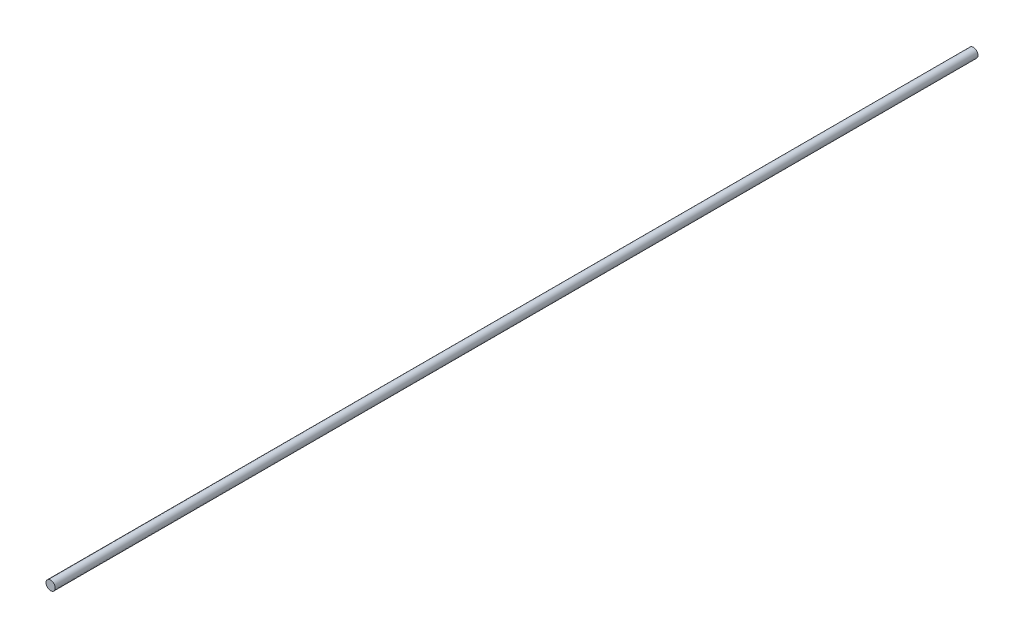
ISO-10303-21;
HEADER;
FILE_DESCRIPTION(('STEP AP214'),'2;1');
FILE_NAME('part.step','',(''),(''),'','','');
FILE_SCHEMA(('AUTOMOTIVE_DESIGN { 1 0 10303 214 1 1 1 1 }'));
ENDSEC;
DATA;
#1=APPLICATION_CONTEXT('core data for automotive mechanical design processes');
#2=APPLICATION_PROTOCOL_DEFINITION('international standard','automotive_design',2000,#1);
#3=PRODUCT_CONTEXT('',#1,'mechanical');
#4=PRODUCT('Part','Part','',(#3));
#5=PRODUCT_RELATED_PRODUCT_CATEGORY('part','',(#4));
#6=PRODUCT_DEFINITION_FORMATION('','',#4);
#7=PRODUCT_DEFINITION_CONTEXT('part definition',#1,'design');
#8=PRODUCT_DEFINITION('design','',#6,#7);
#9=PRODUCT_DEFINITION_SHAPE('','',#8);
#10=(LENGTH_UNIT() NAMED_UNIT(*) SI_UNIT(.MILLI.,.METRE.));
#11=(NAMED_UNIT(*) PLANE_ANGLE_UNIT() SI_UNIT($,.RADIAN.));
#12=(NAMED_UNIT(*) SI_UNIT($,.STERADIAN.) SOLID_ANGLE_UNIT());
#13=UNCERTAINTY_MEASURE_WITH_UNIT(LENGTH_MEASURE(1.E-05),#10,'distance_accuracy_value','');
#14=(GEOMETRIC_REPRESENTATION_CONTEXT(3) GLOBAL_UNCERTAINTY_ASSIGNED_CONTEXT((#13)) GLOBAL_UNIT_ASSIGNED_CONTEXT((#10,
#11,#12)) REPRESENTATION_CONTEXT('',''));
#15=CARTESIAN_POINT('',(0.,0.,0.));
#16=DIRECTION('',(0.,0.,1.));
#17=DIRECTION('',(1.,0.,0.));
#18=AXIS2_PLACEMENT_3D('',#15,#16,#17);
#19=CARTESIAN_POINT('',(0.,0.,150.));
#20=DIRECTION('',(0.,0.,-1.));
#21=DIRECTION('',(-1.,0.,0.));
#22=AXIS2_PLACEMENT_3D('',#19,#20,#21);
#23=CYLINDRICAL_SURFACE('',#22,0.75);
#24=CARTESIAN_POINT('',(0.,0.,150.));
#25=DIRECTION('',(0.,0.,1.));
#26=DIRECTION('',(1.,0.,0.));
#27=AXIS2_PLACEMENT_3D('',#24,#25,#26);
#28=CIRCLE('',#27,0.75);
#29=CARTESIAN_POINT('',(0.75,0.,150.));
#30=VERTEX_POINT('',#29);
#31=EDGE_CURVE('E10',#30,#30,#28,.T.);
#32=ORIENTED_EDGE('',*,*,#31,.F.);
#33=EDGE_LOOP('',(#32));
#34=FACE_BOUND('',#33,.T.);
#35=CARTESIAN_POINT('',(0.,0.,0.));
#36=DIRECTION('',(0.,0.,1.));
#37=DIRECTION('',(1.,0.,0.));
#38=AXIS2_PLACEMENT_3D('',#35,#36,#37);
#39=CIRCLE('',#38,0.75);
#40=CARTESIAN_POINT('',(0.75,0.,0.));
#41=VERTEX_POINT('',#40);
#42=EDGE_CURVE('E40',#41,#41,#39,.T.);
#43=ORIENTED_EDGE('',*,*,#42,.T.);
#44=EDGE_LOOP('',(#43));
#45=FACE_BOUND('',#44,.T.);
#46=ADVANCED_FACE('F37',(#34,#45),#23,.T.);
#47=CARTESIAN_POINT('',(0.,0.,150.));
#48=DIRECTION('',(0.,0.,1.));
#49=DIRECTION('',(1.,0.,0.));
#50=AXIS2_PLACEMENT_3D('',#47,#48,#49);
#51=PLANE('',#50);
#52=ORIENTED_EDGE('',*,*,#31,.T.);
#53=EDGE_LOOP('',(#52));
#54=FACE_BOUND('',#53,.T.);
#55=ADVANCED_FACE('F54',(#54),#51,.T.);
#56=CARTESIAN_POINT('',(0.,0.,0.));
#57=DIRECTION('',(0.,0.,1.));
#58=DIRECTION('',(1.,0.,0.));
#59=AXIS2_PLACEMENT_3D('',#56,#57,#58);
#60=PLANE('',#59);
#61=ORIENTED_EDGE('',*,*,#42,.F.);
#62=EDGE_LOOP('',(#61));
#63=FACE_BOUND('',#62,.T.);
#64=ADVANCED_FACE('F52',(#63),#60,.F.);
#65=CLOSED_SHELL('',(#46,#55,#64));
#66=MANIFOLD_SOLID_BREP('B2',#65);
#67=ADVANCED_BREP_SHAPE_REPRESENTATION('',(#18,#66),#14);
#68=SHAPE_DEFINITION_REPRESENTATION(#9,#67);
ENDSEC;
END-ISO-10303-21;
